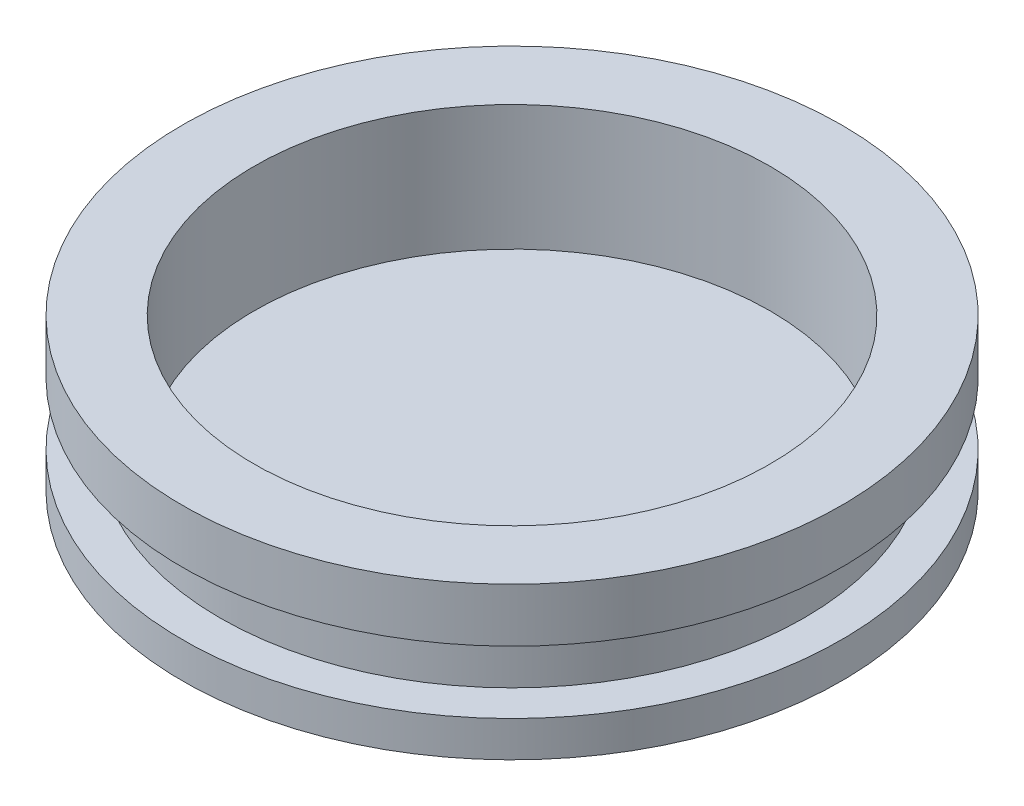
ISO-10303-21;
HEADER;
FILE_DESCRIPTION(('STEP AP214'),'2;1');
FILE_NAME('part.step','',(''),(''),'','','');
FILE_SCHEMA(('AUTOMOTIVE_DESIGN { 1 0 10303 214 1 1 1 1 }'));
ENDSEC;
DATA;
#1=APPLICATION_CONTEXT('core data for automotive mechanical design processes');
#2=APPLICATION_PROTOCOL_DEFINITION('international standard','automotive_design',2000,#1);
#3=PRODUCT_CONTEXT('',#1,'mechanical');
#4=PRODUCT('Part','Part','',(#3));
#5=PRODUCT_RELATED_PRODUCT_CATEGORY('part','',(#4));
#6=PRODUCT_DEFINITION_FORMATION('','',#4);
#7=PRODUCT_DEFINITION_CONTEXT('part definition',#1,'design');
#8=PRODUCT_DEFINITION('design','',#6,#7);
#9=PRODUCT_DEFINITION_SHAPE('','',#8);
#10=(LENGTH_UNIT() NAMED_UNIT(*) SI_UNIT(.MILLI.,.METRE.));
#11=(NAMED_UNIT(*) PLANE_ANGLE_UNIT() SI_UNIT($,.RADIAN.));
#12=(NAMED_UNIT(*) SI_UNIT($,.STERADIAN.) SOLID_ANGLE_UNIT());
#13=UNCERTAINTY_MEASURE_WITH_UNIT(LENGTH_MEASURE(1.E-05),#10,'distance_accuracy_value','');
#14=(GEOMETRIC_REPRESENTATION_CONTEXT(3) GLOBAL_UNCERTAINTY_ASSIGNED_CONTEXT((#13)) GLOBAL_UNIT_ASSIGNED_CONTEXT((#10,
#11,#12)) REPRESENTATION_CONTEXT('',''));
#15=CARTESIAN_POINT('',(0.,0.,0.));
#16=DIRECTION('',(0.,0.,1.));
#17=DIRECTION('',(1.,0.,0.));
#18=AXIS2_PLACEMENT_3D('',#15,#16,#17);
#19=CARTESIAN_POINT('',(0.,-1.5,0.));
#20=DIRECTION('',(0.,-1.,0.));
#21=DIRECTION('',(0.,0.,-1.));
#22=AXIS2_PLACEMENT_3D('',#19,#20,#21);
#23=CYLINDRICAL_SURFACE('',#22,16.32);
#24=CARTESIAN_POINT('',(0.,0.499999999999995,0.));
#25=DIRECTION('',(0.,-1.,0.));
#26=DIRECTION('',(0.,0.,-1.));
#27=AXIS2_PLACEMENT_3D('',#24,#25,#26);
#28=CIRCLE('',#27,16.32);
#29=CARTESIAN_POINT('',(0.,0.499999999999995,-16.32));
#30=VERTEX_POINT('',#29);
#31=EDGE_CURVE('E10',#30,#30,#28,.T.);
#32=ORIENTED_EDGE('',*,*,#31,.F.);
#33=EDGE_LOOP('',(#32));
#34=FACE_BOUND('',#33,.T.);
#35=CARTESIAN_POINT('',(0.,4.,0.));
#36=DIRECTION('',(0.,-1.,0.));
#37=DIRECTION('',(0.,0.,-1.));
#38=AXIS2_PLACEMENT_3D('',#35,#36,#37);
#39=CIRCLE('',#38,16.32);
#40=CARTESIAN_POINT('',(0.,4.,-16.32));
#41=VERTEX_POINT('',#40);
#42=EDGE_CURVE('E61',#41,#41,#39,.T.);
#43=ORIENTED_EDGE('',*,*,#42,.T.);
#44=EDGE_LOOP('',(#43));
#45=FACE_BOUND('',#44,.T.);
#46=ADVANCED_FACE('F33',(#34,#45),#23,.T.);
#47=CARTESIAN_POINT('',(0.,0.499999999999996,0.));
#48=DIRECTION('',(0.,-1.,0.));
#49=DIRECTION('',(0.,0.,-1.));
#50=AXIS2_PLACEMENT_3D('',#47,#48,#49);
#51=PLANE('',#50);
#52=CARTESIAN_POINT('',(0.,0.499999999999995,0.));
#53=DIRECTION('',(0.,-1.,0.));
#54=DIRECTION('',(0.,0.,-1.));
#55=AXIS2_PLACEMENT_3D('',#52,#53,#54);
#56=CIRCLE('',#55,18.42);
#57=CARTESIAN_POINT('',(0.,0.499999999999995,-18.42));
#58=VERTEX_POINT('',#57);
#59=EDGE_CURVE('E39',#58,#58,#56,.T.);
#60=ORIENTED_EDGE('',*,*,#59,.F.);
#61=EDGE_LOOP('',(#60));
#62=FACE_BOUND('',#61,.T.);
#63=ORIENTED_EDGE('',*,*,#31,.T.);
#64=EDGE_LOOP('',(#63));
#65=FACE_BOUND('',#64,.T.);
#66=ADVANCED_FACE('F101',(#62,#65),#51,.F.);
#67=CARTESIAN_POINT('',(0.,-1.5,0.));
#68=DIRECTION('',(0.,-1.,0.));
#69=DIRECTION('',(0.,0.,-1.));
#70=AXIS2_PLACEMENT_3D('',#67,#68,#69);
#71=CYLINDRICAL_SURFACE('',#70,18.42);
#72=CARTESIAN_POINT('',(0.,-1.5,0.));
#73=DIRECTION('',(0.,-1.,0.));
#74=DIRECTION('',(0.,0.,-1.));
#75=AXIS2_PLACEMENT_3D('',#72,#73,#74);
#76=CIRCLE('',#75,18.42);
#77=CARTESIAN_POINT('',(0.,-1.5,-18.42));
#78=VERTEX_POINT('',#77);
#79=EDGE_CURVE('E43',#78,#78,#76,.T.);
#80=ORIENTED_EDGE('',*,*,#79,.F.);
#81=EDGE_LOOP('',(#80));
#82=FACE_BOUND('',#81,.T.);
#83=ORIENTED_EDGE('',*,*,#59,.T.);
#84=EDGE_LOOP('',(#83));
#85=FACE_BOUND('',#84,.T.);
#86=ADVANCED_FACE('F77',(#82,#85),#71,.T.);
#87=CARTESIAN_POINT('',(0.,-1.5,0.));
#88=DIRECTION('',(0.,1.,0.));
#89=DIRECTION('',(0.,0.,1.));
#90=AXIS2_PLACEMENT_3D('',#87,#88,#89);
#91=PLANE('',#90);
#92=ORIENTED_EDGE('',*,*,#79,.T.);
#93=EDGE_LOOP('',(#92));
#94=FACE_BOUND('',#93,.T.);
#95=ADVANCED_FACE('F93',(#94),#91,.F.);
#96=CARTESIAN_POINT('',(0.,0.,0.));
#97=DIRECTION('',(0.,-1.,0.));
#98=DIRECTION('',(0.,0.,-1.));
#99=AXIS2_PLACEMENT_3D('',#96,#97,#98);
#100=PLANE('',#99);
#101=CARTESIAN_POINT('',(0.,0.,0.));
#102=DIRECTION('',(0.,-1.,0.));
#103=DIRECTION('',(0.,0.,-1.));
#104=AXIS2_PLACEMENT_3D('',#101,#102,#103);
#105=CIRCLE('',#104,14.42);
#106=CARTESIAN_POINT('',(0.,0.,-14.42));
#107=VERTEX_POINT('',#106);
#108=EDGE_CURVE('E47',#107,#107,#105,.T.);
#109=ORIENTED_EDGE('',*,*,#108,.F.);
#110=EDGE_LOOP('',(#109));
#111=FACE_BOUND('',#110,.T.);
#112=ADVANCED_FACE('F88',(#111),#100,.F.);
#113=CARTESIAN_POINT('',(0.,-1.5,0.));
#114=DIRECTION('',(0.,-1.,0.));
#115=DIRECTION('',(0.,0.,-1.));
#116=AXIS2_PLACEMENT_3D('',#113,#114,#115);
#117=CYLINDRICAL_SURFACE('',#116,14.42);
#118=CARTESIAN_POINT('',(0.,7.,0.));
#119=DIRECTION('',(0.,-1.,0.));
#120=DIRECTION('',(0.,0.,-1.));
#121=AXIS2_PLACEMENT_3D('',#118,#119,#120);
#122=CIRCLE('',#121,14.42);
#123=CARTESIAN_POINT('',(0.,7.,-14.42));
#124=VERTEX_POINT('',#123);
#125=EDGE_CURVE('E52',#124,#124,#122,.T.);
#126=ORIENTED_EDGE('',*,*,#125,.F.);
#127=EDGE_LOOP('',(#126));
#128=FACE_BOUND('',#127,.T.);
#129=ORIENTED_EDGE('',*,*,#108,.T.);
#130=EDGE_LOOP('',(#129));
#131=FACE_BOUND('',#130,.T.);
#132=ADVANCED_FACE('F82',(#128,#131),#117,.F.);
#133=CARTESIAN_POINT('',(0.,7.,0.));
#134=DIRECTION('',(0.,-1.,0.));
#135=DIRECTION('',(0.,0.,-1.));
#136=AXIS2_PLACEMENT_3D('',#133,#134,#135);
#137=PLANE('',#136);
#138=CARTESIAN_POINT('',(0.,7.,0.));
#139=DIRECTION('',(0.,-1.,0.));
#140=DIRECTION('',(0.,0.,-1.));
#141=AXIS2_PLACEMENT_3D('',#138,#139,#140);
#142=CIRCLE('',#141,18.42);
#143=CARTESIAN_POINT('',(0.,7.,-18.42));
#144=VERTEX_POINT('',#143);
#145=EDGE_CURVE('E55',#144,#144,#142,.T.);
#146=ORIENTED_EDGE('',*,*,#145,.F.);
#147=EDGE_LOOP('',(#146));
#148=FACE_BOUND('',#147,.T.);
#149=ORIENTED_EDGE('',*,*,#125,.T.);
#150=EDGE_LOOP('',(#149));
#151=FACE_BOUND('',#150,.T.);
#152=ADVANCED_FACE('F75',(#148,#151),#137,.F.);
#153=CARTESIAN_POINT('',(0.,4.,0.));
#154=DIRECTION('',(0.,-1.,0.));
#155=DIRECTION('',(0.,0.,-1.));
#156=AXIS2_PLACEMENT_3D('',#153,#154,#155);
#157=CIRCLE('',#156,18.42);
#158=CARTESIAN_POINT('',(0.,4.,-18.42));
#159=VERTEX_POINT('',#158);
#160=EDGE_CURVE('E58',#159,#159,#157,.T.);
#161=ORIENTED_EDGE('',*,*,#160,.F.);
#162=EDGE_LOOP('',(#161));
#163=FACE_BOUND('',#162,.T.);
#164=ORIENTED_EDGE('',*,*,#145,.T.);
#165=EDGE_LOOP('',(#164));
#166=FACE_BOUND('',#165,.T.);
#167=ADVANCED_FACE('F69',(#163,#166),#71,.T.);
#168=CARTESIAN_POINT('',(0.,4.,0.));
#169=DIRECTION('',(0.,1.,0.));
#170=DIRECTION('',(0.,0.,1.));
#171=AXIS2_PLACEMENT_3D('',#168,#169,#170);
#172=PLANE('',#171);
#173=ORIENTED_EDGE('',*,*,#42,.F.);
#174=EDGE_LOOP('',(#173));
#175=FACE_BOUND('',#174,.T.);
#176=ORIENTED_EDGE('',*,*,#160,.T.);
#177=EDGE_LOOP('',(#176));
#178=FACE_BOUND('',#177,.T.);
#179=ADVANCED_FACE('F66',(#175,#178),#172,.F.);
#180=CLOSED_SHELL('',(#46,#66,#86,#95,#112,#132,#152,#167,#179));
#181=MANIFOLD_SOLID_BREP('B2',#180);
#182=ADVANCED_BREP_SHAPE_REPRESENTATION('',(#18,#181),#14);
#183=SHAPE_DEFINITION_REPRESENTATION(#9,#182);
ENDSEC;
END-ISO-10303-21;
